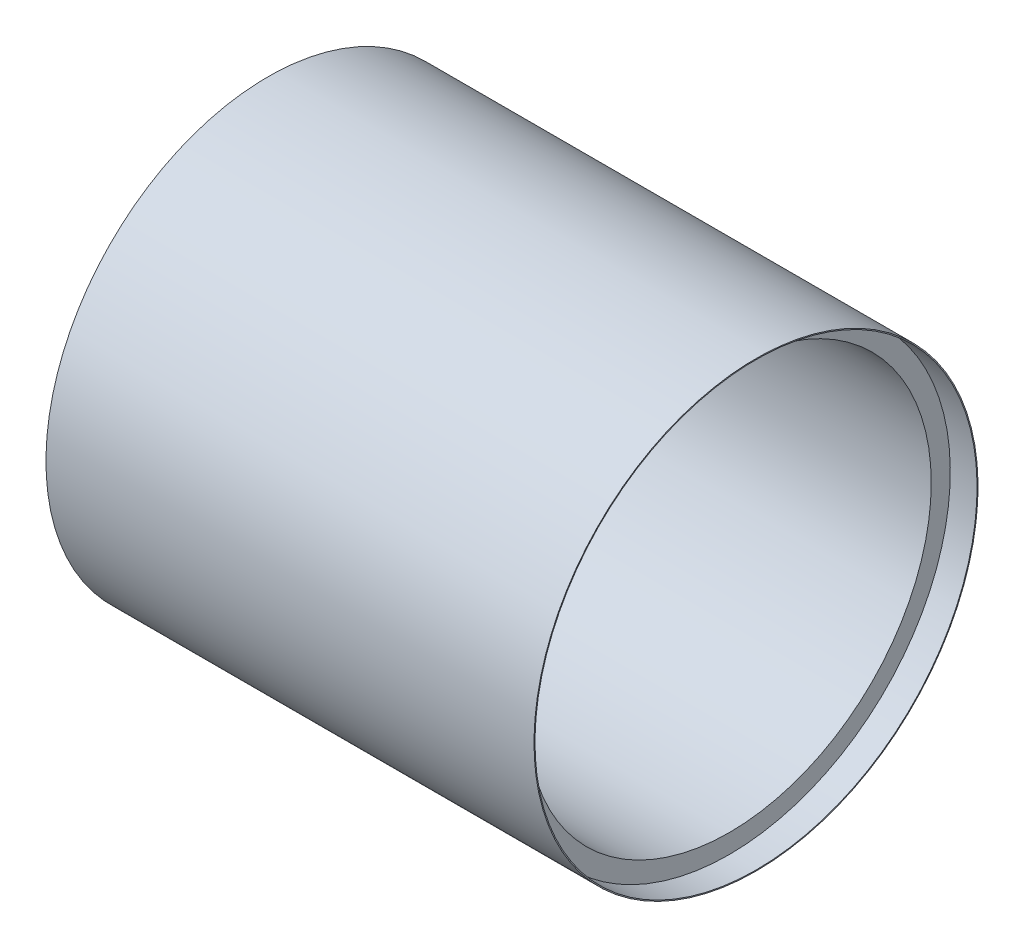
ISO-10303-21;
HEADER;
FILE_DESCRIPTION(('STEP AP214'),'2;1');
FILE_NAME('part.step','',(''),(''),'','','');
FILE_SCHEMA(('AUTOMOTIVE_DESIGN { 1 0 10303 214 1 1 1 1 }'));
ENDSEC;
DATA;
#1=APPLICATION_CONTEXT('core data for automotive mechanical design processes');
#2=APPLICATION_PROTOCOL_DEFINITION('international standard','automotive_design',2000,#1);
#3=PRODUCT_CONTEXT('',#1,'mechanical');
#4=PRODUCT('Part','Part','',(#3));
#5=PRODUCT_RELATED_PRODUCT_CATEGORY('part','',(#4));
#6=PRODUCT_DEFINITION_FORMATION('','',#4);
#7=PRODUCT_DEFINITION_CONTEXT('part definition',#1,'design');
#8=PRODUCT_DEFINITION('design','',#6,#7);
#9=PRODUCT_DEFINITION_SHAPE('','',#8);
#10=(LENGTH_UNIT() NAMED_UNIT(*) SI_UNIT(.MILLI.,.METRE.));
#11=(NAMED_UNIT(*) PLANE_ANGLE_UNIT() SI_UNIT($,.RADIAN.));
#12=(NAMED_UNIT(*) SI_UNIT($,.STERADIAN.) SOLID_ANGLE_UNIT());
#13=UNCERTAINTY_MEASURE_WITH_UNIT(LENGTH_MEASURE(1.E-05),#10,'distance_accuracy_value','');
#14=(GEOMETRIC_REPRESENTATION_CONTEXT(3) GLOBAL_UNCERTAINTY_ASSIGNED_CONTEXT((#13)) GLOBAL_UNIT_ASSIGNED_CONTEXT((#10,
#11,#12)) REPRESENTATION_CONTEXT('',''));
#15=CARTESIAN_POINT('',(0.,0.,0.));
#16=DIRECTION('',(0.,0.,1.));
#17=DIRECTION('',(1.,0.,0.));
#18=AXIS2_PLACEMENT_3D('',#15,#16,#17);
#19=CARTESIAN_POINT('',(0.,0.,0.));
#20=DIRECTION('',(-1.,0.,0.));
#21=DIRECTION('',(0.,-1.,0.));
#22=AXIS2_PLACEMENT_3D('',#19,#20,#21);
#23=CYLINDRICAL_SURFACE('',#22,84.3534);
#24=CARTESIAN_POINT('',(39.146309032124,0.,0.));
#25=DIRECTION('',(-1.,0.,0.));
#26=DIRECTION('',(0.,-1.,0.));
#27=AXIS2_PLACEMENT_3D('',#24,#25,#26);
#28=CIRCLE('',#27,84.3534);
#29=CARTESIAN_POINT('',(39.146309032124,-84.3534,0.));
#30=VERTEX_POINT('',#29);
#31=EDGE_CURVE('E10',#30,#30,#28,.T.);
#32=ORIENTED_EDGE('',*,*,#31,.F.);
#33=EDGE_LOOP('',(#32));
#34=FACE_BOUND('',#33,.T.);
#35=CARTESIAN_POINT('',(224.566309032124,0.,0.));
#36=DIRECTION('',(-1.,0.,0.));
#37=DIRECTION('',(0.,-1.,0.));
#38=AXIS2_PLACEMENT_3D('',#35,#36,#37);
#39=CIRCLE('',#38,84.3534);
#40=CARTESIAN_POINT('',(224.566309032124,-84.3534,0.));
#41=VERTEX_POINT('',#40);
#42=EDGE_CURVE('E60',#41,#41,#39,.T.);
#43=ORIENTED_EDGE('',*,*,#42,.T.);
#44=EDGE_LOOP('',(#43));
#45=FACE_BOUND('',#44,.T.);
#46=ADVANCED_FACE('F32',(#34,#45),#23,.T.);
#47=CARTESIAN_POINT('',(39.146309032124,0.,0.));
#48=DIRECTION('',(1.,0.,0.));
#49=DIRECTION('',(0.,1.,0.));
#50=AXIS2_PLACEMENT_3D('',#47,#48,#49);
#51=PLANE('',#50);
#52=CARTESIAN_POINT('',(39.146309032124,0.,0.));
#53=DIRECTION('',(-1.,0.,0.));
#54=DIRECTION('',(0.,-1.,0.));
#55=AXIS2_PLACEMENT_3D('',#52,#53,#54);
#56=CIRCLE('',#55,83.9724);
#57=CARTESIAN_POINT('',(39.146309032124,-83.9724,0.));
#58=VERTEX_POINT('',#57);
#59=EDGE_CURVE('E38',#58,#58,#56,.T.);
#60=ORIENTED_EDGE('',*,*,#59,.F.);
#61=EDGE_LOOP('',(#60));
#62=FACE_BOUND('',#61,.T.);
#63=ORIENTED_EDGE('',*,*,#31,.T.);
#64=EDGE_LOOP('',(#63));
#65=FACE_BOUND('',#64,.T.);
#66=ADVANCED_FACE('F97',(#62,#65),#51,.F.);
#67=CARTESIAN_POINT('',(0.,0.,0.));
#68=DIRECTION('',(-1.,0.,0.));
#69=DIRECTION('',(0.,-1.,0.));
#70=AXIS2_PLACEMENT_3D('',#67,#68,#69);
#71=CYLINDRICAL_SURFACE('',#70,83.9724);
#72=CARTESIAN_POINT('',(49.306309032124,0.,0.));
#73=DIRECTION('',(-1.,0.,0.));
#74=DIRECTION('',(0.,-1.,0.));
#75=AXIS2_PLACEMENT_3D('',#72,#73,#74);
#76=CIRCLE('',#75,83.9724);
#77=CARTESIAN_POINT('',(49.306309032124,-83.9724,0.));
#78=VERTEX_POINT('',#77);
#79=EDGE_CURVE('E42',#78,#78,#76,.T.);
#80=ORIENTED_EDGE('',*,*,#79,.F.);
#81=EDGE_LOOP('',(#80));
#82=FACE_BOUND('',#81,.T.);
#83=ORIENTED_EDGE('',*,*,#59,.T.);
#84=EDGE_LOOP('',(#83));
#85=FACE_BOUND('',#84,.T.);
#86=ADVANCED_FACE('F92',(#82,#85),#71,.F.);
#87=CARTESIAN_POINT('',(49.306309032124,0.,0.));
#88=DIRECTION('',(1.,0.,0.));
#89=DIRECTION('',(0.,1.,0.));
#90=AXIS2_PLACEMENT_3D('',#87,#88,#89);
#91=PLANE('',#90);
#92=CARTESIAN_POINT('',(49.306309032124,0.,0.));
#93=DIRECTION('',(-1.,0.,0.));
#94=DIRECTION('',(0.,-1.,0.));
#95=AXIS2_PLACEMENT_3D('',#92,#93,#94);
#96=CIRCLE('',#95,76.7334);
#97=CARTESIAN_POINT('',(49.306309032124,-76.7334,0.));
#98=VERTEX_POINT('',#97);
#99=EDGE_CURVE('E46',#98,#98,#96,.T.);
#100=ORIENTED_EDGE('',*,*,#99,.F.);
#101=EDGE_LOOP('',(#100));
#102=FACE_BOUND('',#101,.T.);
#103=ORIENTED_EDGE('',*,*,#79,.T.);
#104=EDGE_LOOP('',(#103));
#105=FACE_BOUND('',#104,.T.);
#106=ADVANCED_FACE('F86',(#102,#105),#91,.F.);
#107=CARTESIAN_POINT('',(0.,0.,0.));
#108=DIRECTION('',(-1.,0.,0.));
#109=DIRECTION('',(0.,-1.,0.));
#110=AXIS2_PLACEMENT_3D('',#107,#108,#109);
#111=CYLINDRICAL_SURFACE('',#110,76.7334);
#112=CARTESIAN_POINT('',(214.406309032124,0.,0.));
#113=DIRECTION('',(-1.,0.,0.));
#114=DIRECTION('',(0.,-1.,0.));
#115=AXIS2_PLACEMENT_3D('',#112,#113,#114);
#116=CIRCLE('',#115,76.7334);
#117=CARTESIAN_POINT('',(214.406309032124,-76.7334,0.));
#118=VERTEX_POINT('',#117);
#119=EDGE_CURVE('E51',#118,#118,#116,.T.);
#120=ORIENTED_EDGE('',*,*,#119,.F.);
#121=EDGE_LOOP('',(#120));
#122=FACE_BOUND('',#121,.T.);
#123=ORIENTED_EDGE('',*,*,#99,.T.);
#124=EDGE_LOOP('',(#123));
#125=FACE_BOUND('',#124,.T.);
#126=ADVANCED_FACE('F80',(#122,#125),#111,.F.);
#127=CARTESIAN_POINT('',(214.406309032124,0.,0.));
#128=DIRECTION('',(-1.,0.,0.));
#129=DIRECTION('',(0.,-1.,0.));
#130=AXIS2_PLACEMENT_3D('',#127,#128,#129);
#131=PLANE('',#130);
#132=CARTESIAN_POINT('',(214.406309032124,0.,0.));
#133=DIRECTION('',(-1.,0.,0.));
#134=DIRECTION('',(0.,-1.,0.));
#135=AXIS2_PLACEMENT_3D('',#132,#133,#134);
#136=CIRCLE('',#135,83.9724);
#137=CARTESIAN_POINT('',(214.406309032124,-83.9724,0.));
#138=VERTEX_POINT('',#137);
#139=EDGE_CURVE('E54',#138,#138,#136,.T.);
#140=ORIENTED_EDGE('',*,*,#139,.F.);
#141=EDGE_LOOP('',(#140));
#142=FACE_BOUND('',#141,.T.);
#143=ORIENTED_EDGE('',*,*,#119,.T.);
#144=EDGE_LOOP('',(#143));
#145=FACE_BOUND('',#144,.T.);
#146=ADVANCED_FACE('F74',(#142,#145),#131,.F.);
#147=CARTESIAN_POINT('',(0.,0.,0.));
#148=DIRECTION('',(-1.,0.,0.));
#149=DIRECTION('',(0.,-1.,0.));
#150=AXIS2_PLACEMENT_3D('',#147,#148,#149);
#151=CYLINDRICAL_SURFACE('',#150,83.9724);
#152=CARTESIAN_POINT('',(224.566309032124,0.,0.));
#153=DIRECTION('',(-1.,0.,0.));
#154=DIRECTION('',(0.,-1.,0.));
#155=AXIS2_PLACEMENT_3D('',#152,#153,#154);
#156=CIRCLE('',#155,83.9724);
#157=CARTESIAN_POINT('',(224.566309032124,-83.9724,0.));
#158=VERTEX_POINT('',#157);
#159=EDGE_CURVE('E57',#158,#158,#156,.T.);
#160=ORIENTED_EDGE('',*,*,#159,.F.);
#161=EDGE_LOOP('',(#160));
#162=FACE_BOUND('',#161,.T.);
#163=ORIENTED_EDGE('',*,*,#139,.T.);
#164=EDGE_LOOP('',(#163));
#165=FACE_BOUND('',#164,.T.);
#166=ADVANCED_FACE('F68',(#162,#165),#151,.F.);
#167=CARTESIAN_POINT('',(224.566309032124,0.,0.));
#168=DIRECTION('',(-1.,0.,0.));
#169=DIRECTION('',(0.,-1.,0.));
#170=AXIS2_PLACEMENT_3D('',#167,#168,#169);
#171=PLANE('',#170);
#172=ORIENTED_EDGE('',*,*,#42,.F.);
#173=EDGE_LOOP('',(#172));
#174=FACE_BOUND('',#173,.T.);
#175=ORIENTED_EDGE('',*,*,#159,.T.);
#176=EDGE_LOOP('',(#175));
#177=FACE_BOUND('',#176,.T.);
#178=ADVANCED_FACE('F65',(#174,#177),#171,.F.);
#179=CLOSED_SHELL('',(#46,#66,#86,#106,#126,#146,#166,#178));
#180=MANIFOLD_SOLID_BREP('B2',#179);
#181=ADVANCED_BREP_SHAPE_REPRESENTATION('',(#18,#180),#14);
#182=SHAPE_DEFINITION_REPRESENTATION(#9,#181);
ENDSEC;
END-ISO-10303-21;
